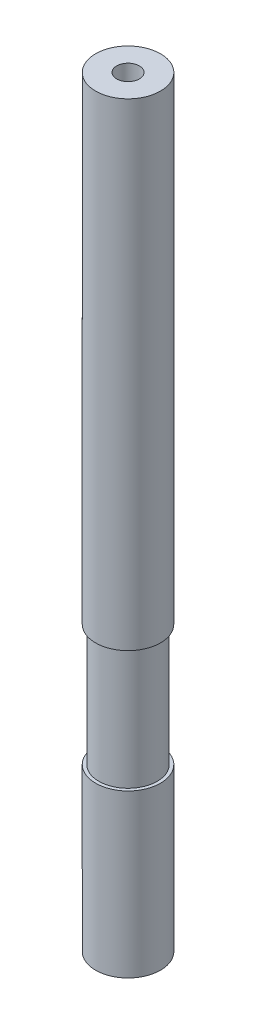
ISO-10303-21;
HEADER;
FILE_DESCRIPTION(('STEP AP214'),'2;1');
FILE_NAME('part.step','',(''),(''),'','','');
FILE_SCHEMA(('AUTOMOTIVE_DESIGN { 1 0 10303 214 1 1 1 1 }'));
ENDSEC;
DATA;
#1=APPLICATION_CONTEXT('core data for automotive mechanical design processes');
#2=APPLICATION_PROTOCOL_DEFINITION('international standard','automotive_design',2000,#1);
#3=PRODUCT_CONTEXT('',#1,'mechanical');
#4=PRODUCT('Part','Part','',(#3));
#5=PRODUCT_RELATED_PRODUCT_CATEGORY('part','',(#4));
#6=PRODUCT_DEFINITION_FORMATION('','',#4);
#7=PRODUCT_DEFINITION_CONTEXT('part definition',#1,'design');
#8=PRODUCT_DEFINITION('design','',#6,#7);
#9=PRODUCT_DEFINITION_SHAPE('','',#8);
#10=(LENGTH_UNIT() NAMED_UNIT(*) SI_UNIT(.MILLI.,.METRE.));
#11=(NAMED_UNIT(*) PLANE_ANGLE_UNIT() SI_UNIT($,.RADIAN.));
#12=(NAMED_UNIT(*) SI_UNIT($,.STERADIAN.) SOLID_ANGLE_UNIT());
#13=UNCERTAINTY_MEASURE_WITH_UNIT(LENGTH_MEASURE(1.E-05),#10,'distance_accuracy_value','');
#14=(GEOMETRIC_REPRESENTATION_CONTEXT(3) GLOBAL_UNCERTAINTY_ASSIGNED_CONTEXT((#13)) GLOBAL_UNIT_ASSIGNED_CONTEXT((#10,
#11,#12)) REPRESENTATION_CONTEXT('',''));
#15=CARTESIAN_POINT('',(0.,0.,0.));
#16=DIRECTION('',(0.,0.,1.));
#17=DIRECTION('',(1.,0.,0.));
#18=AXIS2_PLACEMENT_3D('',#15,#16,#17);
#19=CARTESIAN_POINT('',(0.,47.,0.));
#20=DIRECTION('',(0.,-1.,0.));
#21=DIRECTION('',(0.,0.,-1.));
#22=AXIS2_PLACEMENT_3D('',#19,#20,#21);
#23=CYLINDRICAL_SURFACE('',#22,4.);
#24=CARTESIAN_POINT('',(0.,47.,0.));
#25=DIRECTION('',(0.,1.,0.));
#26=DIRECTION('',(0.,0.,1.));
#27=AXIS2_PLACEMENT_3D('',#24,#25,#26);
#28=CIRCLE('',#27,4.);
#29=CARTESIAN_POINT('',(0.,47.,4.));
#30=VERTEX_POINT('',#29);
#31=EDGE_CURVE('E10',#30,#30,#28,.T.);
#32=ORIENTED_EDGE('',*,*,#31,.F.);
#33=EDGE_LOOP('',(#32));
#34=FACE_BOUND('',#33,.T.);
#35=CARTESIAN_POINT('',(0.,-12.,0.));
#36=DIRECTION('',(0.,-1.,0.));
#37=DIRECTION('',(0.,0.,-1.));
#38=AXIS2_PLACEMENT_3D('',#35,#36,#37);
#39=CIRCLE('',#38,4.);
#40=CARTESIAN_POINT('',(0.,-12.,-4.));
#41=VERTEX_POINT('',#40);
#42=EDGE_CURVE('E64',#41,#41,#39,.T.);
#43=ORIENTED_EDGE('',*,*,#42,.F.);
#44=EDGE_LOOP('',(#43));
#45=FACE_BOUND('',#44,.T.);
#46=ADVANCED_FACE('F37',(#34,#45),#23,.T.);
#47=CARTESIAN_POINT('',(0.,47.,0.));
#48=DIRECTION('',(0.,1.,0.));
#49=DIRECTION('',(0.,0.,1.));
#50=AXIS2_PLACEMENT_3D('',#47,#48,#49);
#51=PLANE('',#50);
#52=CARTESIAN_POINT('',(0.,47.,0.));
#53=DIRECTION('',(0.,-1.,0.));
#54=DIRECTION('',(0.,0.,-1.));
#55=AXIS2_PLACEMENT_3D('',#52,#53,#54);
#56=CIRCLE('',#55,1.4);
#57=CARTESIAN_POINT('',(0.,47.,-1.4));
#58=VERTEX_POINT('',#57);
#59=EDGE_CURVE('E60',#58,#58,#56,.T.);
#60=ORIENTED_EDGE('',*,*,#59,.T.);
#61=EDGE_LOOP('',(#60));
#62=FACE_BOUND('',#61,.T.);
#63=ORIENTED_EDGE('',*,*,#31,.T.);
#64=EDGE_LOOP('',(#63));
#65=FACE_BOUND('',#64,.T.);
#66=ADVANCED_FACE('F96',(#62,#65),#51,.T.);
#67=CARTESIAN_POINT('',(0.,37.,0.));
#68=DIRECTION('',(0.,1.,0.));
#69=DIRECTION('',(0.,0.,1.));
#70=AXIS2_PLACEMENT_3D('',#67,#68,#69);
#71=CYLINDRICAL_SURFACE('',#70,1.4);
#72=CARTESIAN_POINT('',(0.,37.,0.));
#73=DIRECTION('',(0.,-1.,0.));
#74=DIRECTION('',(0.,0.,-1.));
#75=AXIS2_PLACEMENT_3D('',#72,#73,#74);
#76=CIRCLE('',#75,1.4);
#77=CARTESIAN_POINT('',(0.,37.,-1.4));
#78=VERTEX_POINT('',#77);
#79=EDGE_CURVE('E56',#78,#78,#76,.T.);
#80=ORIENTED_EDGE('',*,*,#79,.T.);
#81=EDGE_LOOP('',(#80));
#82=FACE_BOUND('',#81,.T.);
#83=ORIENTED_EDGE('',*,*,#59,.F.);
#84=EDGE_LOOP('',(#83));
#85=FACE_BOUND('',#84,.T.);
#86=ADVANCED_FACE('F101',(#82,#85),#71,.F.);
#87=CARTESIAN_POINT('',(0.,37.,0.));
#88=DIRECTION('',(0.,1.,0.));
#89=DIRECTION('',(0.,0.,-1.));
#90=AXIS2_PLACEMENT_3D('',#87,#88,#89);
#91=PLANE('',#90);
#92=ORIENTED_EDGE('',*,*,#79,.F.);
#93=EDGE_LOOP('',(#92));
#94=FACE_BOUND('',#93,.T.);
#95=ADVANCED_FACE('F91',(#94),#91,.T.);
#96=CARTESIAN_POINT('',(0.,-12.,0.));
#97=DIRECTION('',(0.,-1.,0.));
#98=DIRECTION('',(0.,0.,-1.));
#99=AXIS2_PLACEMENT_3D('',#96,#97,#98);
#100=PLANE('',#99);
#101=CARTESIAN_POINT('',(0.,-12.,0.));
#102=DIRECTION('',(0.,-1.,0.));
#103=DIRECTION('',(0.,0.,-1.));
#104=AXIS2_PLACEMENT_3D('',#101,#102,#103);
#105=CIRCLE('',#104,3.6);
#106=CARTESIAN_POINT('',(0.,-12.,-3.6));
#107=VERTEX_POINT('',#106);
#108=EDGE_CURVE('E72',#107,#107,#105,.T.);
#109=ORIENTED_EDGE('',*,*,#108,.F.);
#110=EDGE_LOOP('',(#109));
#111=FACE_BOUND('',#110,.T.);
#112=ORIENTED_EDGE('',*,*,#42,.T.);
#113=EDGE_LOOP('',(#112));
#114=FACE_BOUND('',#113,.T.);
#115=ADVANCED_FACE('F87',(#111,#114),#100,.T.);
#116=CARTESIAN_POINT('',(0.,-27.,0.));
#117=DIRECTION('',(0.,-1.,0.));
#118=DIRECTION('',(0.,0.,-1.));
#119=AXIS2_PLACEMENT_3D('',#116,#117,#118);
#120=PLANE('',#119);
#121=CARTESIAN_POINT('',(0.,-27.,0.));
#122=DIRECTION('',(0.,-1.,0.));
#123=DIRECTION('',(0.,0.,-1.));
#124=AXIS2_PLACEMENT_3D('',#121,#122,#123);
#125=CIRCLE('',#124,3.6);
#126=CARTESIAN_POINT('',(0.,-27.,-3.6));
#127=VERTEX_POINT('',#126);
#128=EDGE_CURVE('E76',#127,#127,#125,.T.);
#129=ORIENTED_EDGE('',*,*,#128,.T.);
#130=EDGE_LOOP('',(#129));
#131=FACE_BOUND('',#130,.T.);
#132=CARTESIAN_POINT('',(0.,-27.,0.));
#133=DIRECTION('',(0.,-1.,0.));
#134=DIRECTION('',(0.,0.,-1.));
#135=AXIS2_PLACEMENT_3D('',#132,#133,#134);
#136=CIRCLE('',#135,4.);
#137=CARTESIAN_POINT('',(0.,-27.,-4.));
#138=VERTEX_POINT('',#137);
#139=EDGE_CURVE('E68',#138,#138,#136,.T.);
#140=ORIENTED_EDGE('',*,*,#139,.F.);
#141=EDGE_LOOP('',(#140));
#142=FACE_BOUND('',#141,.T.);
#143=ADVANCED_FACE('F90',(#131,#142),#120,.F.);
#144=CARTESIAN_POINT('',(0.,-12.,0.));
#145=DIRECTION('',(0.,-1.,0.));
#146=DIRECTION('',(0.,0.,-1.));
#147=AXIS2_PLACEMENT_3D('',#144,#145,#146);
#148=CYLINDRICAL_SURFACE('',#147,3.6);
#149=ORIENTED_EDGE('',*,*,#108,.T.);
#150=EDGE_LOOP('',(#149));
#151=FACE_BOUND('',#150,.T.);
#152=ORIENTED_EDGE('',*,*,#128,.F.);
#153=EDGE_LOOP('',(#152));
#154=FACE_BOUND('',#153,.T.);
#155=ADVANCED_FACE('F84',(#151,#154),#148,.T.);
#156=CARTESIAN_POINT('',(0.,-37.,0.));
#157=DIRECTION('',(0.,-1.,0.));
#158=DIRECTION('',(0.,0.,-1.));
#159=AXIS2_PLACEMENT_3D('',#156,#157,#158);
#160=PLANE('',#159);
#161=CARTESIAN_POINT('',(0.,-37.,0.));
#162=DIRECTION('',(0.,-1.,0.));
#163=DIRECTION('',(0.,0.,-1.));
#164=AXIS2_PLACEMENT_3D('',#161,#162,#163);
#165=CIRCLE('',#164,1.4);
#166=CARTESIAN_POINT('',(0.,-37.,-1.4));
#167=VERTEX_POINT('',#166);
#168=EDGE_CURVE('E50',#167,#167,#165,.T.);
#169=ORIENTED_EDGE('',*,*,#168,.T.);
#170=EDGE_LOOP('',(#169));
#171=FACE_BOUND('',#170,.T.);
#172=ADVANCED_FACE('F123',(#171),#160,.T.);
#173=CARTESIAN_POINT('',(0.,-37.,0.));
#174=DIRECTION('',(0.,-1.,0.));
#175=DIRECTION('',(0.,0.,-1.));
#176=AXIS2_PLACEMENT_3D('',#173,#174,#175);
#177=CYLINDRICAL_SURFACE('',#176,1.4);
#178=ORIENTED_EDGE('',*,*,#168,.F.);
#179=EDGE_LOOP('',(#178));
#180=FACE_BOUND('',#179,.T.);
#181=CARTESIAN_POINT('',(0.,-47.,0.));
#182=DIRECTION('',(0.,-1.,0.));
#183=DIRECTION('',(0.,0.,-1.));
#184=AXIS2_PLACEMENT_3D('',#181,#182,#183);
#185=CIRCLE('',#184,1.4);
#186=CARTESIAN_POINT('',(0.,-47.,-1.4));
#187=VERTEX_POINT('',#186);
#188=EDGE_CURVE('E52',#187,#187,#185,.T.);
#189=ORIENTED_EDGE('',*,*,#188,.T.);
#190=EDGE_LOOP('',(#189));
#191=FACE_BOUND('',#190,.T.);
#192=ADVANCED_FACE('F110',(#180,#191),#177,.F.);
#193=CARTESIAN_POINT('',(0.,-47.,0.));
#194=DIRECTION('',(0.,1.,0.));
#195=DIRECTION('',(0.,0.,1.));
#196=AXIS2_PLACEMENT_3D('',#193,#194,#195);
#197=PLANE('',#196);
#198=ORIENTED_EDGE('',*,*,#188,.F.);
#199=EDGE_LOOP('',(#198));
#200=FACE_BOUND('',#199,.T.);
#201=CARTESIAN_POINT('',(0.,-47.,0.));
#202=DIRECTION('',(0.,1.,0.));
#203=DIRECTION('',(0.,0.,1.));
#204=AXIS2_PLACEMENT_3D('',#201,#202,#203);
#205=CIRCLE('',#204,4.);
#206=CARTESIAN_POINT('',(0.,-47.,4.));
#207=VERTEX_POINT('',#206);
#208=EDGE_CURVE('E41',#207,#207,#205,.T.);
#209=ORIENTED_EDGE('',*,*,#208,.F.);
#210=EDGE_LOOP('',(#209));
#211=FACE_BOUND('',#210,.T.);
#212=ADVANCED_FACE('F105',(#200,#211),#197,.F.);
#213=ORIENTED_EDGE('',*,*,#139,.T.);
#214=EDGE_LOOP('',(#213));
#215=FACE_BOUND('',#214,.T.);
#216=ORIENTED_EDGE('',*,*,#208,.T.);
#217=EDGE_LOOP('',(#216));
#218=FACE_BOUND('',#217,.T.);
#219=ADVANCED_FACE('F39',(#215,#218),#23,.T.);
#220=CLOSED_SHELL('',(#46,#66,#86,#95,#115,#143,#155,#172,#192,#212,#219));
#221=MANIFOLD_SOLID_BREP('B2',#220);
#222=ADVANCED_BREP_SHAPE_REPRESENTATION('',(#18,#221),#14);
#223=SHAPE_DEFINITION_REPRESENTATION(#9,#222);
ENDSEC;
END-ISO-10303-21;
